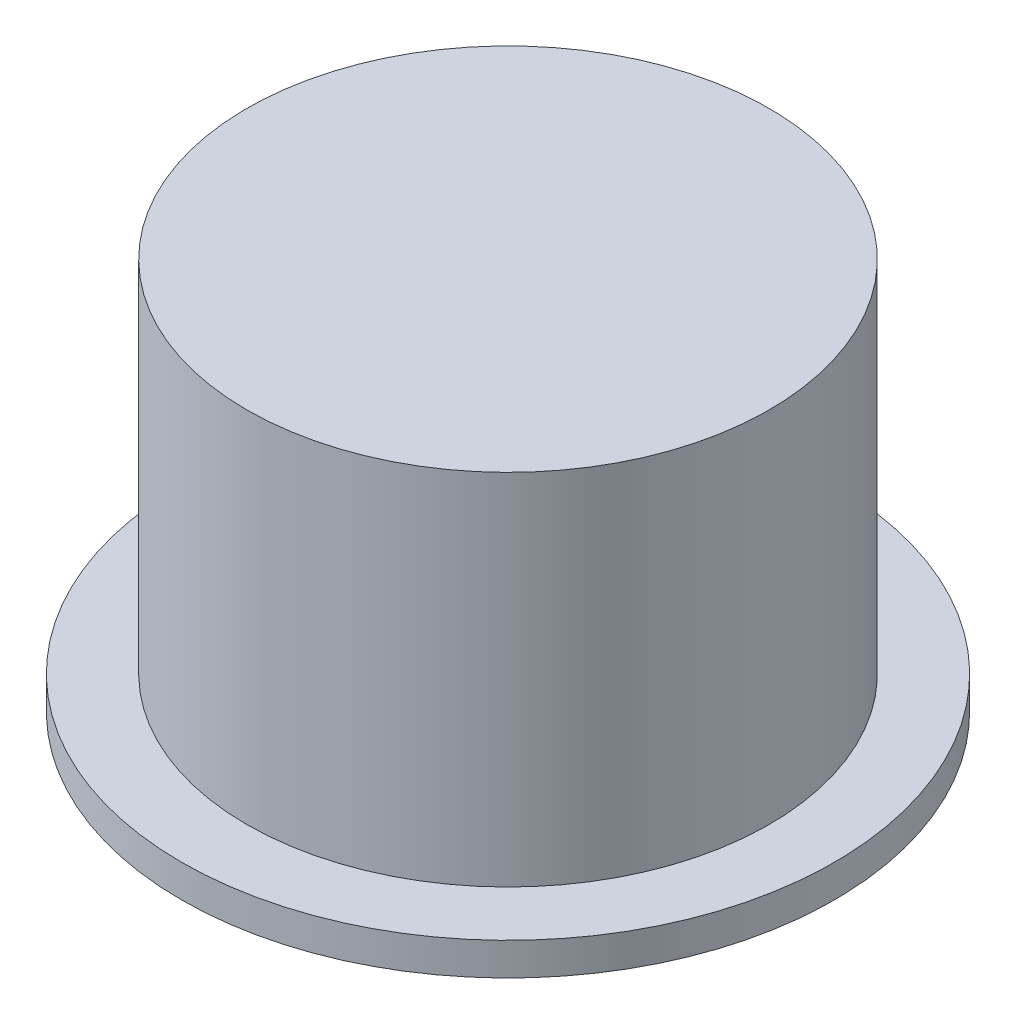
ISO-10303-21;
HEADER;
FILE_DESCRIPTION(('STEP AP214'),'2;1');
FILE_NAME('part.step','',(''),(''),'','','');
FILE_SCHEMA(('AUTOMOTIVE_DESIGN { 1 0 10303 214 1 1 1 1 }'));
ENDSEC;
DATA;
#1=APPLICATION_CONTEXT('core data for automotive mechanical design processes');
#2=APPLICATION_PROTOCOL_DEFINITION('international standard','automotive_design',2000,#1);
#3=PRODUCT_CONTEXT('',#1,'mechanical');
#4=PRODUCT('Part','Part','',(#3));
#5=PRODUCT_RELATED_PRODUCT_CATEGORY('part','',(#4));
#6=PRODUCT_DEFINITION_FORMATION('','',#4);
#7=PRODUCT_DEFINITION_CONTEXT('part definition',#1,'design');
#8=PRODUCT_DEFINITION('design','',#6,#7);
#9=PRODUCT_DEFINITION_SHAPE('','',#8);
#10=(LENGTH_UNIT() NAMED_UNIT(*) SI_UNIT(.MILLI.,.METRE.));
#11=(NAMED_UNIT(*) PLANE_ANGLE_UNIT() SI_UNIT($,.RADIAN.));
#12=(NAMED_UNIT(*) SI_UNIT($,.STERADIAN.) SOLID_ANGLE_UNIT());
#13=UNCERTAINTY_MEASURE_WITH_UNIT(LENGTH_MEASURE(1.E-05),#10,'distance_accuracy_value','');
#14=(GEOMETRIC_REPRESENTATION_CONTEXT(3) GLOBAL_UNCERTAINTY_ASSIGNED_CONTEXT((#13)) GLOBAL_UNIT_ASSIGNED_CONTEXT((#10,
#11,#12)) REPRESENTATION_CONTEXT('',''));
#15=CARTESIAN_POINT('',(0.,0.,0.));
#16=DIRECTION('',(0.,0.,1.));
#17=DIRECTION('',(1.,0.,0.));
#18=AXIS2_PLACEMENT_3D('',#15,#16,#17);
#19=CARTESIAN_POINT('',(0.,0.5,0.));
#20=DIRECTION('',(0.,1.,0.));
#21=DIRECTION('',(0.,0.,1.));
#22=AXIS2_PLACEMENT_3D('',#19,#20,#21);
#23=PLANE('',#22);
#24=CARTESIAN_POINT('',(0.,0.5,0.));
#25=DIRECTION('',(0.,1.,0.));
#26=DIRECTION('',(0.,0.,1.));
#27=AXIS2_PLACEMENT_3D('',#24,#25,#26);
#28=CIRCLE('',#27,5.);
#29=CARTESIAN_POINT('',(0.,0.5,5.));
#30=VERTEX_POINT('',#29);
#31=EDGE_CURVE('E10',#30,#30,#28,.T.);
#32=ORIENTED_EDGE('',*,*,#31,.T.);
#33=EDGE_LOOP('',(#32));
#34=FACE_BOUND('',#33,.T.);
#35=CARTESIAN_POINT('',(0.,0.5,0.));
#36=DIRECTION('',(0.,1.,0.));
#37=DIRECTION('',(0.,0.,1.));
#38=AXIS2_PLACEMENT_3D('',#35,#36,#37);
#39=CIRCLE('',#38,4.);
#40=CARTESIAN_POINT('',(0.,0.5,4.));
#41=VERTEX_POINT('',#40);
#42=EDGE_CURVE('E50',#41,#41,#39,.T.);
#43=ORIENTED_EDGE('',*,*,#42,.F.);
#44=EDGE_LOOP('',(#43));
#45=FACE_BOUND('',#44,.T.);
#46=ADVANCED_FACE('F39',(#34,#45),#23,.T.);
#47=CARTESIAN_POINT('',(0.,0.,0.));
#48=DIRECTION('',(0.,1.,0.));
#49=DIRECTION('',(0.,0.,1.));
#50=AXIS2_PLACEMENT_3D('',#47,#48,#49);
#51=PLANE('',#50);
#52=CARTESIAN_POINT('',(0.,0.,0.));
#53=DIRECTION('',(0.,1.,0.));
#54=DIRECTION('',(0.,0.,1.));
#55=AXIS2_PLACEMENT_3D('',#52,#53,#54);
#56=CIRCLE('',#55,5.);
#57=CARTESIAN_POINT('',(0.,0.,5.));
#58=VERTEX_POINT('',#57);
#59=EDGE_CURVE('E43',#58,#58,#56,.T.);
#60=ORIENTED_EDGE('',*,*,#59,.F.);
#61=EDGE_LOOP('',(#60));
#62=FACE_BOUND('',#61,.T.);
#63=ADVANCED_FACE('F70',(#62),#51,.F.);
#64=CARTESIAN_POINT('',(0.,0.5,0.));
#65=DIRECTION('',(0.,-1.,0.));
#66=DIRECTION('',(0.,0.,-1.));
#67=AXIS2_PLACEMENT_3D('',#64,#65,#66);
#68=CYLINDRICAL_SURFACE('',#67,5.);
#69=ORIENTED_EDGE('',*,*,#31,.F.);
#70=EDGE_LOOP('',(#69));
#71=FACE_BOUND('',#70,.T.);
#72=ORIENTED_EDGE('',*,*,#59,.T.);
#73=EDGE_LOOP('',(#72));
#74=FACE_BOUND('',#73,.T.);
#75=ADVANCED_FACE('F41',(#71,#74),#68,.T.);
#76=CARTESIAN_POINT('',(0.,6.,0.));
#77=DIRECTION('',(0.,-1.,0.));
#78=DIRECTION('',(0.,0.,-1.));
#79=AXIS2_PLACEMENT_3D('',#76,#77,#78);
#80=CYLINDRICAL_SURFACE('',#79,4.);
#81=ORIENTED_EDGE('',*,*,#42,.T.);
#82=EDGE_LOOP('',(#81));
#83=FACE_BOUND('',#82,.T.);
#84=CARTESIAN_POINT('',(0.,6.,0.));
#85=DIRECTION('',(0.,1.,0.));
#86=DIRECTION('',(0.,0.,1.));
#87=AXIS2_PLACEMENT_3D('',#84,#85,#86);
#88=CIRCLE('',#87,4.);
#89=CARTESIAN_POINT('',(0.,6.,4.));
#90=VERTEX_POINT('',#89);
#91=EDGE_CURVE('E54',#90,#90,#88,.T.);
#92=ORIENTED_EDGE('',*,*,#91,.F.);
#93=EDGE_LOOP('',(#92));
#94=FACE_BOUND('',#93,.T.);
#95=ADVANCED_FACE('F60',(#83,#94),#80,.T.);
#96=CARTESIAN_POINT('',(0.,6.,0.));
#97=DIRECTION('',(0.,1.,0.));
#98=DIRECTION('',(0.,0.,1.));
#99=AXIS2_PLACEMENT_3D('',#96,#97,#98);
#100=PLANE('',#99);
#101=ORIENTED_EDGE('',*,*,#91,.T.);
#102=EDGE_LOOP('',(#101));
#103=FACE_BOUND('',#102,.T.);
#104=ADVANCED_FACE('F58',(#103),#100,.T.);
#105=CLOSED_SHELL('',(#46,#63,#75,#95,#104));
#106=MANIFOLD_SOLID_BREP('B2',#105);
#107=ADVANCED_BREP_SHAPE_REPRESENTATION('',(#18,#106),#14);
#108=SHAPE_DEFINITION_REPRESENTATION(#9,#107);
ENDSEC;
END-ISO-10303-21;
